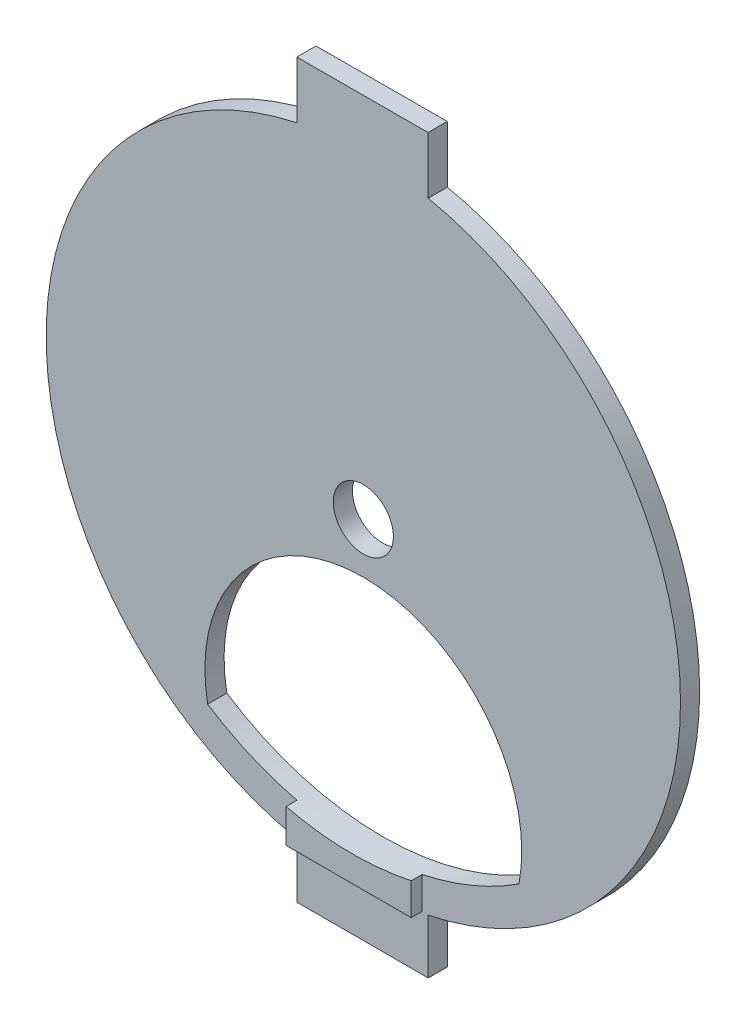
ISO-10303-21;
HEADER;
FILE_DESCRIPTION(('STEP AP214'),'2;1');
FILE_NAME('part.step','',(''),(''),'','','');
FILE_SCHEMA(('AUTOMOTIVE_DESIGN { 1 0 10303 214 1 1 1 1 }'));
ENDSEC;
DATA;
#1=APPLICATION_CONTEXT('core data for automotive mechanical design processes');
#2=APPLICATION_PROTOCOL_DEFINITION('international standard','automotive_design',2000,#1);
#3=PRODUCT_CONTEXT('',#1,'mechanical');
#4=PRODUCT('Part','Part','',(#3));
#5=PRODUCT_RELATED_PRODUCT_CATEGORY('part','',(#4));
#6=PRODUCT_DEFINITION_FORMATION('','',#4);
#7=PRODUCT_DEFINITION_CONTEXT('part definition',#1,'design');
#8=PRODUCT_DEFINITION('design','',#6,#7);
#9=PRODUCT_DEFINITION_SHAPE('','',#8);
#10=(LENGTH_UNIT() NAMED_UNIT(*) SI_UNIT(.MILLI.,.METRE.));
#11=(NAMED_UNIT(*) PLANE_ANGLE_UNIT() SI_UNIT($,.RADIAN.));
#12=(NAMED_UNIT(*) SI_UNIT($,.STERADIAN.) SOLID_ANGLE_UNIT());
#13=UNCERTAINTY_MEASURE_WITH_UNIT(LENGTH_MEASURE(1.E-05),#10,'distance_accuracy_value','');
#14=(GEOMETRIC_REPRESENTATION_CONTEXT(3) GLOBAL_UNCERTAINTY_ASSIGNED_CONTEXT((#13)) GLOBAL_UNIT_ASSIGNED_CONTEXT((#10,
#11,#12)) REPRESENTATION_CONTEXT('',''));
#15=CARTESIAN_POINT('',(0.,0.,0.));
#16=DIRECTION('',(0.,0.,1.));
#17=DIRECTION('',(1.,0.,0.));
#18=AXIS2_PLACEMENT_3D('',#15,#16,#17);
#19=CARTESIAN_POINT('',(0.,0.,11.1252));
#20=DIRECTION('',(0.,0.,1.));
#21=DIRECTION('',(1.,0.,0.));
#22=AXIS2_PLACEMENT_3D('',#19,#20,#21);
#23=PLANE('',#22);
#24=CARTESIAN_POINT('',(0.,0.,11.1252));
#25=DIRECTION('',(0.,0.,1.));
#26=DIRECTION('',(1.,0.,0.));
#27=AXIS2_PLACEMENT_3D('',#24,#25,#26);
#28=CIRCLE('',#27,17.4625);
#29=CARTESIAN_POINT('',(17.4625,0.,11.1252));
#30=VERTEX_POINT('',#29);
#31=EDGE_CURVE('E336',#30,#30,#28,.T.);
#32=ORIENTED_EDGE('',*,*,#31,.F.);
#33=EDGE_LOOP('',(#32));
#34=FACE_BOUND('',#33,.T.);
#35=CARTESIAN_POINT('',(0.,0.,11.1252));
#36=DIRECTION('',(0.,0.,1.));
#37=DIRECTION('',(1.,0.,0.));
#38=AXIS2_PLACEMENT_3D('',#35,#36,#37);
#39=CIRCLE('',#38,184.15);
#40=CARTESIAN_POINT('',(-38.5208823396615,180.07599541242,11.1252));
#41=VERTEX_POINT('',#40);
#42=CARTESIAN_POINT('',(-38.5208823396615,-180.07599541242,11.1252));
#43=VERTEX_POINT('',#42);
#44=EDGE_CURVE('E366',#41,#43,#39,.T.);
#45=ORIENTED_EDGE('',*,*,#44,.T.);
#46=DIRECTION('',(0.,1.,0.));
#47=VECTOR('',#46,1.);
#48=CARTESIAN_POINT('',(-38.5208823396615,0.,11.1252));
#49=LINE('',#48,#47);
#50=CARTESIAN_POINT('',(-38.5208823396615,-160.543301398015,11.1252));
#51=VERTEX_POINT('',#50);
#52=EDGE_CURVE('E215',#43,#51,#49,.T.);
#53=ORIENTED_EDGE('',*,*,#52,.T.);
#54=CARTESIAN_POINT('',(0.,0.,11.1252));
#55=DIRECTION('',(0.,0.,1.));
#56=DIRECTION('',(1.,0.,0.));
#57=AXIS2_PLACEMENT_3D('',#54,#55,#56);
#58=CIRCLE('',#57,165.1);
#59=CARTESIAN_POINT('',(-90.375326038002,-138.167689578732,11.1252));
#60=VERTEX_POINT('',#59);
#61=EDGE_CURVE('E322',#60,#51,#58,.T.);
#62=ORIENTED_EDGE('',*,*,#61,.F.);
#63=CARTESIAN_POINT('',(0.,-121.099295255726,11.1252));
#64=DIRECTION('',(0.,0.,1.));
#65=DIRECTION('',(1.,0.,0.));
#66=AXIS2_PLACEMENT_3D('',#63,#64,#65);
#67=CIRCLE('',#66,91.9729832137721);
#68=CARTESIAN_POINT('',(90.375326038002,-138.167689578732,11.1252));
#69=VERTEX_POINT('',#68);
#70=EDGE_CURVE('E313',#60,#69,#67,.F.);
#71=ORIENTED_EDGE('',*,*,#70,.T.);
#72=CARTESIAN_POINT('',(34.1499767632428,-161.529530077537,11.1252));
#73=VERTEX_POINT('',#72);
#74=EDGE_CURVE('E316',#73,#69,#58,.T.);
#75=ORIENTED_EDGE('',*,*,#74,.F.);
#76=DIRECTION('',(0.,1.,0.));
#77=VECTOR('',#76,1.);
#78=CARTESIAN_POINT('',(34.1499767632428,0.,11.1252));
#79=LINE('',#78,#77);
#80=CARTESIAN_POINT('',(34.1499767632428,-180.07599541242,11.1252));
#81=VERTEX_POINT('',#80);
#82=EDGE_CURVE('E208',#81,#73,#79,.T.);
#83=ORIENTED_EDGE('',*,*,#82,.F.);
#84=DIRECTION('',(1.,0.,0.));
#85=VECTOR('',#84,1.);
#86=CARTESIAN_POINT('',(0.,-180.07599541242,11.1252));
#87=LINE('',#86,#85);
#88=EDGE_CURVE('E312',#43,#81,#87,.T.);
#89=ORIENTED_EDGE('',*,*,#88,.F.);
#90=DIRECTION('',(0.,-1.,0.));
#91=VECTOR('',#90,1.);
#92=CARTESIAN_POINT('',(-38.5208823396615,0.,11.1252));
#93=LINE('',#92,#91);
#94=CARTESIAN_POINT('',(-38.5208823396615,-211.82599541242,11.1252));
#95=VERTEX_POINT('',#94);
#96=EDGE_CURVE('E376',#43,#95,#93,.T.);
#97=ORIENTED_EDGE('',*,*,#96,.T.);
#98=DIRECTION('',(1.,0.,0.));
#99=VECTOR('',#98,1.);
#100=CARTESIAN_POINT('',(0.,-211.82599541242,11.1252));
#101=LINE('',#100,#99);
#102=CARTESIAN_POINT('',(37.6791176603385,-211.82599541242,11.1252));
#103=VERTEX_POINT('',#102);
#104=EDGE_CURVE('E378',#95,#103,#101,.T.);
#105=ORIENTED_EDGE('',*,*,#104,.T.);
#106=DIRECTION('',(0.,-1.,0.));
#107=VECTOR('',#106,1.);
#108=CARTESIAN_POINT('',(37.6791176603384,0.,11.1252));
#109=LINE('',#108,#107);
#110=CARTESIAN_POINT('',(37.6791176603385,-180.254005759479,11.1252));
#111=VERTEX_POINT('',#110);
#112=EDGE_CURVE('E381',#111,#103,#109,.T.);
#113=ORIENTED_EDGE('',*,*,#112,.F.);
#114=CARTESIAN_POINT('',(37.6791176603385,180.254005759479,11.1252));
#115=VERTEX_POINT('',#114);
#116=EDGE_CURVE('E368',#111,#115,#39,.T.);
#117=ORIENTED_EDGE('',*,*,#116,.T.);
#118=DIRECTION('',(-0.00233608741903019,0.999997271344063,0.));
#119=VECTOR('',#118,1.);
#120=CARTESIAN_POINT('',(38.1,0.0890051735295454,11.1252));
#121=LINE('',#120,#119);
#122=CARTESIAN_POINT('',(37.6019798432796,213.274005759479,11.1252));
#123=VERTEX_POINT('',#122);
#124=EDGE_CURVE('E343',#115,#123,#121,.T.);
#125=ORIENTED_EDGE('',*,*,#124,.T.);
#126=DIRECTION('',(0.999997271344063,0.00233608741903044,0.));
#127=VECTOR('',#126,1.);
#128=CARTESIAN_POINT('',(-0.498020156720491,213.18500058595,11.1252));
#129=LINE('',#128,#127);
#130=CARTESIAN_POINT('',(-38.5980201567204,213.09599541242,11.1252));
#131=VERTEX_POINT('',#130);
#132=EDGE_CURVE('E345',#131,#123,#129,.T.);
#133=ORIENTED_EDGE('',*,*,#132,.F.);
#134=DIRECTION('',(-0.00233608741903019,0.999997271344063,0.));
#135=VECTOR('',#134,1.);
#136=CARTESIAN_POINT('',(-38.1,-0.0890051735295453,11.1252));
#137=LINE('',#136,#135);
#138=EDGE_CURVE('E349',#41,#131,#137,.T.);
#139=ORIENTED_EDGE('',*,*,#138,.F.);
#140=EDGE_LOOP('',(#45,#53,#62,#71,#75,#83,#89,#97,#105,#113,#117,#125,#133,#139));
#141=FACE_BOUND('',#140,.T.);
#142=ADVANCED_FACE('F191',(#34,#141),#23,.T.);
#143=CARTESIAN_POINT('',(0.,0.,0.));
#144=DIRECTION('',(0.,0.,1.));
#145=DIRECTION('',(1.,0.,0.));
#146=AXIS2_PLACEMENT_3D('',#143,#144,#145);
#147=PLANE('',#146);
#148=DIRECTION('',(-0.00233608741903019,0.999997271344063,0.));
#149=VECTOR('',#148,1.);
#150=CARTESIAN_POINT('',(38.1,0.0890051735295454,0.));
#151=LINE('',#150,#149);
#152=CARTESIAN_POINT('',(37.6791176603385,180.254005759479,0.));
#153=VERTEX_POINT('',#152);
#154=CARTESIAN_POINT('',(37.6019798432796,213.274005759479,0.));
#155=VERTEX_POINT('',#154);
#156=EDGE_CURVE('E353',#153,#155,#151,.T.);
#157=ORIENTED_EDGE('',*,*,#156,.F.);
#158=CARTESIAN_POINT('',(0.,0.,0.));
#159=DIRECTION('',(0.,0.,1.));
#160=DIRECTION('',(1.,0.,0.));
#161=AXIS2_PLACEMENT_3D('',#158,#159,#160);
#162=CIRCLE('',#161,184.15);
#163=CARTESIAN_POINT('',(37.6791176603385,-180.254005759479,0.));
#164=VERTEX_POINT('',#163);
#165=EDGE_CURVE('E369',#164,#153,#162,.T.);
#166=ORIENTED_EDGE('',*,*,#165,.F.);
#167=DIRECTION('',(0.,-1.,0.));
#168=VECTOR('',#167,1.);
#169=CARTESIAN_POINT('',(37.6791176603384,0.,0.));
#170=LINE('',#169,#168);
#171=CARTESIAN_POINT('',(37.6791176603385,-211.82599541242,0.));
#172=VERTEX_POINT('',#171);
#173=EDGE_CURVE('E379',#164,#172,#170,.T.);
#174=ORIENTED_EDGE('',*,*,#173,.T.);
#175=DIRECTION('',(1.,0.,0.));
#176=VECTOR('',#175,1.);
#177=CARTESIAN_POINT('',(0.,-211.82599541242,0.));
#178=LINE('',#177,#176);
#179=CARTESIAN_POINT('',(-38.5208823396615,-211.82599541242,0.));
#180=VERTEX_POINT('',#179);
#181=EDGE_CURVE('E386',#180,#172,#178,.T.);
#182=ORIENTED_EDGE('',*,*,#181,.F.);
#183=DIRECTION('',(0.,-1.,0.));
#184=VECTOR('',#183,1.);
#185=CARTESIAN_POINT('',(-38.5208823396615,0.,0.));
#186=LINE('',#185,#184);
#187=CARTESIAN_POINT('',(-38.5208823396615,-180.07599541242,0.));
#188=VERTEX_POINT('',#187);
#189=EDGE_CURVE('E342',#188,#180,#186,.T.);
#190=ORIENTED_EDGE('',*,*,#189,.F.);
#191=CARTESIAN_POINT('',(-38.5208823396615,180.07599541242,0.));
#192=VERTEX_POINT('',#191);
#193=EDGE_CURVE('E370',#192,#188,#162,.T.);
#194=ORIENTED_EDGE('',*,*,#193,.F.);
#195=DIRECTION('',(-0.00233608741903019,0.999997271344063,0.));
#196=VECTOR('',#195,1.);
#197=CARTESIAN_POINT('',(-38.1,-0.0890051735295453,0.));
#198=LINE('',#197,#196);
#199=CARTESIAN_POINT('',(-38.5980201567204,213.09599541242,0.));
#200=VERTEX_POINT('',#199);
#201=EDGE_CURVE('E346',#192,#200,#198,.T.);
#202=ORIENTED_EDGE('',*,*,#201,.T.);
#203=DIRECTION('',(0.999997271344063,0.00233608741903044,0.));
#204=VECTOR('',#203,1.);
#205=CARTESIAN_POINT('',(-0.498020156720491,213.18500058595,0.));
#206=LINE('',#205,#204);
#207=EDGE_CURVE('E356',#200,#155,#206,.T.);
#208=ORIENTED_EDGE('',*,*,#207,.T.);
#209=EDGE_LOOP('',(#157,#166,#174,#182,#190,#194,#202,#208));
#210=FACE_BOUND('',#209,.T.);
#211=CARTESIAN_POINT('',(0.,0.,0.));
#212=DIRECTION('',(0.,0.,1.));
#213=DIRECTION('',(1.,0.,0.));
#214=AXIS2_PLACEMENT_3D('',#211,#212,#213);
#215=CIRCLE('',#214,17.4625);
#216=CARTESIAN_POINT('',(17.4625,0.,0.));
#217=VERTEX_POINT('',#216);
#218=EDGE_CURVE('E339',#217,#217,#215,.T.);
#219=ORIENTED_EDGE('',*,*,#218,.T.);
#220=EDGE_LOOP('',(#219));
#221=FACE_BOUND('',#220,.T.);
#222=CARTESIAN_POINT('',(0.,-121.099295255726,0.));
#223=DIRECTION('',(0.,0.,1.));
#224=DIRECTION('',(1.,0.,0.));
#225=AXIS2_PLACEMENT_3D('',#222,#223,#224);
#226=CIRCLE('',#225,91.9729832137721);
#227=CARTESIAN_POINT('',(-90.375326038002,-138.167689578732,0.));
#228=VERTEX_POINT('',#227);
#229=CARTESIAN_POINT('',(90.375326038002,-138.167689578732,0.));
#230=VERTEX_POINT('',#229);
#231=EDGE_CURVE('E333',#228,#230,#226,.F.);
#232=ORIENTED_EDGE('',*,*,#231,.F.);
#233=CARTESIAN_POINT('',(0.,0.,0.));
#234=DIRECTION('',(0.,0.,1.));
#235=DIRECTION('',(1.,0.,0.));
#236=AXIS2_PLACEMENT_3D('',#233,#234,#235);
#237=CIRCLE('',#236,165.1);
#238=EDGE_CURVE('E328',#228,#230,#237,.T.);
#239=ORIENTED_EDGE('',*,*,#238,.T.);
#240=EDGE_LOOP('',(#232,#239));
#241=FACE_BOUND('',#240,.T.);
#242=ADVANCED_FACE('F404',(#210,#221,#241),#147,.F.);
#243=CARTESIAN_POINT('',(38.1,0.0890051735295454,11.1252));
#244=DIRECTION('',(-0.999997271344062,-0.00233608741903019,0.));
#245=DIRECTION('',(0.00233608741903019,-0.999997271344063,0.));
#246=AXIS2_PLACEMENT_3D('',#243,#244,#245);
#247=PLANE('',#246);
#248=ORIENTED_EDGE('',*,*,#156,.T.);
#249=DIRECTION('',(0.,0.,-1.));
#250=VECTOR('',#249,1.);
#251=CARTESIAN_POINT('',(37.6019798432796,213.274005759479,11.1252));
#252=LINE('',#251,#250);
#253=EDGE_CURVE('E200',#123,#155,#252,.T.);
#254=ORIENTED_EDGE('',*,*,#253,.F.);
#255=ORIENTED_EDGE('',*,*,#124,.F.);
#256=DIRECTION('',(0.,0.,-1.));
#257=VECTOR('',#256,1.);
#258=CARTESIAN_POINT('',(37.6791176603385,180.254005759479,11.1252));
#259=LINE('',#258,#257);
#260=EDGE_CURVE('E12',#115,#153,#259,.T.);
#261=ORIENTED_EDGE('',*,*,#260,.T.);
#262=EDGE_LOOP('',(#248,#254,#255,#261));
#263=FACE_BOUND('',#262,.T.);
#264=ADVANCED_FACE('F417',(#263),#247,.F.);
#265=CARTESIAN_POINT('',(-0.498020156720491,213.18500058595,11.1252));
#266=DIRECTION('',(-0.00233608741903044,0.999997271344062,0.));
#267=DIRECTION('',(-0.999997271344063,-0.00233608741903044,0.));
#268=AXIS2_PLACEMENT_3D('',#265,#266,#267);
#269=PLANE('',#268);
#270=ORIENTED_EDGE('',*,*,#207,.F.);
#271=DIRECTION('',(0.,0.,-1.));
#272=VECTOR('',#271,1.);
#273=CARTESIAN_POINT('',(-38.5980201567204,213.09599541242,11.1252));
#274=LINE('',#273,#272);
#275=EDGE_CURVE('E363',#131,#200,#274,.T.);
#276=ORIENTED_EDGE('',*,*,#275,.F.);
#277=ORIENTED_EDGE('',*,*,#132,.T.);
#278=ORIENTED_EDGE('',*,*,#253,.T.);
#279=EDGE_LOOP('',(#270,#276,#277,#278));
#280=FACE_BOUND('',#279,.T.);
#281=ADVANCED_FACE('F454',(#280),#269,.T.);
#282=CARTESIAN_POINT('',(-38.1,-0.0890051735295453,11.1252));
#283=DIRECTION('',(-0.999997271344062,-0.00233608741903019,0.));
#284=DIRECTION('',(0.00233608741903019,-0.999997271344063,0.));
#285=AXIS2_PLACEMENT_3D('',#282,#283,#284);
#286=PLANE('',#285);
#287=ORIENTED_EDGE('',*,*,#201,.F.);
#288=DIRECTION('',(0.,0.,-1.));
#289=VECTOR('',#288,1.);
#290=CARTESIAN_POINT('',(-38.5208823396615,180.07599541242,11.1252));
#291=LINE('',#290,#289);
#292=EDGE_CURVE('E352',#41,#192,#291,.T.);
#293=ORIENTED_EDGE('',*,*,#292,.F.);
#294=ORIENTED_EDGE('',*,*,#138,.T.);
#295=ORIENTED_EDGE('',*,*,#275,.T.);
#296=EDGE_LOOP('',(#287,#293,#294,#295));
#297=FACE_BOUND('',#296,.T.);
#298=ADVANCED_FACE('F424',(#297),#286,.T.);
#299=CARTESIAN_POINT('',(0.,-211.82599541242,11.1252));
#300=DIRECTION('',(0.,1.,0.));
#301=DIRECTION('',(-1.,0.,0.));
#302=AXIS2_PLACEMENT_3D('',#299,#300,#301);
#303=PLANE('',#302);
#304=ORIENTED_EDGE('',*,*,#181,.T.);
#305=DIRECTION('',(0.,0.,-1.));
#306=VECTOR('',#305,1.);
#307=CARTESIAN_POINT('',(37.6791176603385,-211.82599541242,11.1252));
#308=LINE('',#307,#306);
#309=EDGE_CURVE('E384',#103,#172,#308,.T.);
#310=ORIENTED_EDGE('',*,*,#309,.F.);
#311=ORIENTED_EDGE('',*,*,#104,.F.);
#312=DIRECTION('',(0.,0.,-1.));
#313=VECTOR('',#312,1.);
#314=CARTESIAN_POINT('',(-38.5208823396615,-211.82599541242,11.1252));
#315=LINE('',#314,#313);
#316=EDGE_CURVE('E195',#95,#180,#315,.T.);
#317=ORIENTED_EDGE('',*,*,#316,.T.);
#318=EDGE_LOOP('',(#304,#310,#311,#317));
#319=FACE_BOUND('',#318,.T.);
#320=ADVANCED_FACE('F398',(#319),#303,.F.);
#321=CARTESIAN_POINT('',(37.6791176603384,0.,11.1252));
#322=DIRECTION('',(1.,0.,0.));
#323=DIRECTION('',(0.,1.,0.));
#324=AXIS2_PLACEMENT_3D('',#321,#322,#323);
#325=PLANE('',#324);
#326=ORIENTED_EDGE('',*,*,#173,.F.);
#327=DIRECTION('',(0.,0.,-1.));
#328=VECTOR('',#327,1.);
#329=CARTESIAN_POINT('',(37.6791176603385,-180.254005759479,11.1252));
#330=LINE('',#329,#328);
#331=EDGE_CURVE('E373',#111,#164,#330,.T.);
#332=ORIENTED_EDGE('',*,*,#331,.F.);
#333=ORIENTED_EDGE('',*,*,#112,.T.);
#334=ORIENTED_EDGE('',*,*,#309,.T.);
#335=EDGE_LOOP('',(#326,#332,#333,#334));
#336=FACE_BOUND('',#335,.T.);
#337=ADVANCED_FACE('F409',(#336),#325,.T.);
#338=CARTESIAN_POINT('',(-38.5208823396615,0.,11.1252));
#339=DIRECTION('',(1.,0.,0.));
#340=DIRECTION('',(0.,1.,0.));
#341=AXIS2_PLACEMENT_3D('',#338,#339,#340);
#342=PLANE('',#341);
#343=ORIENTED_EDGE('',*,*,#189,.T.);
#344=ORIENTED_EDGE('',*,*,#316,.F.);
#345=ORIENTED_EDGE('',*,*,#96,.F.);
#346=DIRECTION('',(0.,0.,-1.));
#347=VECTOR('',#346,1.);
#348=CARTESIAN_POINT('',(-38.5208823396615,-180.07599541242,11.1252));
#349=LINE('',#348,#347);
#350=EDGE_CURVE('E357',#43,#188,#349,.T.);
#351=ORIENTED_EDGE('',*,*,#350,.T.);
#352=EDGE_LOOP('',(#343,#344,#345,#351));
#353=FACE_BOUND('',#352,.T.);
#354=ADVANCED_FACE('F193',(#353),#342,.F.);
#355=CARTESIAN_POINT('',(0.,0.,11.1252));
#356=DIRECTION('',(0.,0.,-1.));
#357=DIRECTION('',(-1.,0.,0.));
#358=AXIS2_PLACEMENT_3D('',#355,#356,#357);
#359=CYLINDRICAL_SURFACE('',#358,184.15);
#360=ORIENTED_EDGE('',*,*,#193,.T.);
#361=ORIENTED_EDGE('',*,*,#350,.F.);
#362=ORIENTED_EDGE('',*,*,#44,.F.);
#363=ORIENTED_EDGE('',*,*,#292,.T.);
#364=EDGE_LOOP('',(#360,#361,#362,#363));
#365=FACE_BOUND('',#364,.T.);
#366=ADVANCED_FACE('F429',(#365),#359,.T.);
#367=ORIENTED_EDGE('',*,*,#165,.T.);
#368=ORIENTED_EDGE('',*,*,#260,.F.);
#369=ORIENTED_EDGE('',*,*,#116,.F.);
#370=ORIENTED_EDGE('',*,*,#331,.T.);
#371=EDGE_LOOP('',(#367,#368,#369,#370));
#372=FACE_BOUND('',#371,.T.);
#373=ADVANCED_FACE('F415',(#372),#359,.T.);
#374=CARTESIAN_POINT('',(0.,0.,-1.5748));
#375=DIRECTION('',(0.,0.,1.));
#376=DIRECTION('',(1.,0.,0.));
#377=AXIS2_PLACEMENT_3D('',#374,#375,#376);
#378=CYLINDRICAL_SURFACE('',#377,17.4625);
#379=ORIENTED_EDGE('',*,*,#31,.T.);
#380=EDGE_LOOP('',(#379));
#381=FACE_BOUND('',#380,.T.);
#382=ORIENTED_EDGE('',*,*,#218,.F.);
#383=EDGE_LOOP('',(#382));
#384=FACE_BOUND('',#383,.T.);
#385=ADVANCED_FACE('F466',(#381,#384),#378,.F.);
#386=CARTESIAN_POINT('',(0.,-121.099295255726,-1.5748));
#387=DIRECTION('',(0.,0.,1.));
#388=DIRECTION('',(1.,0.,0.));
#389=AXIS2_PLACEMENT_3D('',#386,#387,#388);
#390=CYLINDRICAL_SURFACE('',#389,91.9729832137721);
#391=ORIENTED_EDGE('',*,*,#231,.T.);
#392=DIRECTION('',(0.,0.,1.));
#393=VECTOR('',#392,1.);
#394=CARTESIAN_POINT('',(90.375326038002,-138.167689578732,-1.5748));
#395=LINE('',#394,#393);
#396=EDGE_CURVE('E325',#230,#69,#395,.T.);
#397=ORIENTED_EDGE('',*,*,#396,.T.);
#398=ORIENTED_EDGE('',*,*,#70,.F.);
#399=DIRECTION('',(0.,0.,1.));
#400=VECTOR('',#399,1.);
#401=CARTESIAN_POINT('',(-90.375326038002,-138.167689578732,-1.5748));
#402=LINE('',#401,#400);
#403=EDGE_CURVE('E324',#228,#60,#402,.T.);
#404=ORIENTED_EDGE('',*,*,#403,.F.);
#405=EDGE_LOOP('',(#391,#397,#398,#404));
#406=FACE_BOUND('',#405,.T.);
#407=ADVANCED_FACE('F445',(#406),#390,.F.);
#408=CARTESIAN_POINT('',(0.,0.,-1.5748));
#409=DIRECTION('',(0.,0.,1.));
#410=DIRECTION('',(1.,0.,0.));
#411=AXIS2_PLACEMENT_3D('',#408,#409,#410);
#412=CYLINDRICAL_SURFACE('',#411,165.1);
#413=ORIENTED_EDGE('',*,*,#403,.T.);
#414=ORIENTED_EDGE('',*,*,#61,.T.);
#415=DIRECTION('',(0.,0.,-1.));
#416=VECTOR('',#415,1.);
#417=CARTESIAN_POINT('',(-38.5208823396615,-160.543301398015,17.4752));
#418=LINE('',#417,#416);
#419=CARTESIAN_POINT('',(-38.5208823396615,-160.543301398015,17.4752));
#420=VERTEX_POINT('',#419);
#421=EDGE_CURVE('E318',#420,#51,#418,.T.);
#422=ORIENTED_EDGE('',*,*,#421,.F.);
#423=CARTESIAN_POINT('',(0.,0.,17.4752));
#424=DIRECTION('',(0.,0.,1.));
#425=DIRECTION('',(1.,0.,0.));
#426=AXIS2_PLACEMENT_3D('',#423,#424,#425);
#427=CIRCLE('',#426,165.1);
#428=CARTESIAN_POINT('',(34.1499767632428,-161.529530077537,17.4752));
#429=VERTEX_POINT('',#428);
#430=EDGE_CURVE('E300',#429,#420,#427,.F.);
#431=ORIENTED_EDGE('',*,*,#430,.F.);
#432=DIRECTION('',(0.,0.,-1.));
#433=VECTOR('',#432,1.);
#434=CARTESIAN_POINT('',(34.1499767632428,-161.529530077537,17.4752));
#435=LINE('',#434,#433);
#436=EDGE_CURVE('E297',#429,#73,#435,.T.);
#437=ORIENTED_EDGE('',*,*,#436,.T.);
#438=ORIENTED_EDGE('',*,*,#74,.T.);
#439=ORIENTED_EDGE('',*,*,#396,.F.);
#440=ORIENTED_EDGE('',*,*,#238,.F.);
#441=EDGE_LOOP('',(#413,#414,#422,#431,#437,#438,#439,#440));
#442=FACE_BOUND('',#441,.T.);
#443=ADVANCED_FACE('F442',(#442),#412,.F.);
#444=CARTESIAN_POINT('',(0.,-180.07599541242,17.4752));
#445=DIRECTION('',(0.,1.,0.));
#446=DIRECTION('',(0.,0.,1.));
#447=AXIS2_PLACEMENT_3D('',#444,#445,#446);
#448=PLANE('',#447);
#449=ORIENTED_EDGE('',*,*,#88,.T.);
#450=DIRECTION('',(0.,0.,-1.));
#451=VECTOR('',#450,1.);
#452=CARTESIAN_POINT('',(34.1499767632428,-180.07599541242,17.4752));
#453=LINE('',#452,#451);
#454=CARTESIAN_POINT('',(34.1499767632428,-180.07599541242,17.4752));
#455=VERTEX_POINT('',#454);
#456=EDGE_CURVE('E294',#455,#81,#453,.T.);
#457=ORIENTED_EDGE('',*,*,#456,.F.);
#458=DIRECTION('',(1.,0.,0.));
#459=VECTOR('',#458,1.);
#460=CARTESIAN_POINT('',(0.,-180.07599541242,17.4752));
#461=LINE('',#460,#459);
#462=CARTESIAN_POINT('',(-38.5208823396615,-180.07599541242,17.4752));
#463=VERTEX_POINT('',#462);
#464=EDGE_CURVE('E301',#463,#455,#461,.T.);
#465=ORIENTED_EDGE('',*,*,#464,.F.);
#466=DIRECTION('',(0.,0.,-1.));
#467=VECTOR('',#466,1.);
#468=CARTESIAN_POINT('',(-38.5208823396615,-180.07599541242,17.4752));
#469=LINE('',#468,#467);
#470=EDGE_CURVE('E430',#463,#43,#469,.T.);
#471=ORIENTED_EDGE('',*,*,#470,.T.);
#472=EDGE_LOOP('',(#449,#457,#465,#471));
#473=FACE_BOUND('',#472,.T.);
#474=ADVANCED_FACE('F311',(#473),#448,.F.);
#475=CARTESIAN_POINT('',(34.1499767632428,0.,17.4752));
#476=DIRECTION('',(-1.,0.,0.));
#477=DIRECTION('',(0.,0.,1.));
#478=AXIS2_PLACEMENT_3D('',#475,#476,#477);
#479=PLANE('',#478);
#480=ORIENTED_EDGE('',*,*,#82,.T.);
#481=ORIENTED_EDGE('',*,*,#436,.F.);
#482=DIRECTION('',(0.,1.,0.));
#483=VECTOR('',#482,1.);
#484=CARTESIAN_POINT('',(34.1499767632428,0.,17.4752));
#485=LINE('',#484,#483);
#486=EDGE_CURVE('E290',#455,#429,#485,.T.);
#487=ORIENTED_EDGE('',*,*,#486,.F.);
#488=ORIENTED_EDGE('',*,*,#456,.T.);
#489=EDGE_LOOP('',(#480,#481,#487,#488));
#490=FACE_BOUND('',#489,.T.);
#491=ADVANCED_FACE('F292',(#490),#479,.F.);
#492=CARTESIAN_POINT('',(-38.5208823396615,0.,17.4752));
#493=DIRECTION('',(-1.,0.,0.));
#494=DIRECTION('',(0.,-1.,0.));
#495=AXIS2_PLACEMENT_3D('',#492,#493,#494);
#496=PLANE('',#495);
#497=ORIENTED_EDGE('',*,*,#52,.F.);
#498=ORIENTED_EDGE('',*,*,#470,.F.);
#499=DIRECTION('',(0.,1.,0.));
#500=VECTOR('',#499,1.);
#501=CARTESIAN_POINT('',(-38.5208823396615,0.,17.4752));
#502=LINE('',#501,#500);
#503=EDGE_CURVE('E307',#463,#420,#502,.T.);
#504=ORIENTED_EDGE('',*,*,#503,.T.);
#505=ORIENTED_EDGE('',*,*,#421,.T.);
#506=EDGE_LOOP('',(#497,#498,#504,#505));
#507=FACE_BOUND('',#506,.T.);
#508=ADVANCED_FACE('F434',(#507),#496,.T.);
#509=CARTESIAN_POINT('',(0.,0.,17.4752));
#510=DIRECTION('',(0.,0.,1.));
#511=DIRECTION('',(1.,0.,0.));
#512=AXIS2_PLACEMENT_3D('',#509,#510,#511);
#513=PLANE('',#512);
#514=ORIENTED_EDGE('',*,*,#464,.T.);
#515=ORIENTED_EDGE('',*,*,#486,.T.);
#516=ORIENTED_EDGE('',*,*,#430,.T.);
#517=ORIENTED_EDGE('',*,*,#503,.F.);
#518=EDGE_LOOP('',(#514,#515,#516,#517));
#519=FACE_BOUND('',#518,.T.);
#520=ADVANCED_FACE('F305',(#519),#513,.T.);
#521=CLOSED_SHELL('',(#142,#242,#264,#281,#298,#320,#337,#354,#366,#373,#385,#407,#443,#474,
#491,#508,#520));
#522=MANIFOLD_SOLID_BREP('B2',#521);
#523=ADVANCED_BREP_SHAPE_REPRESENTATION('',(#18,#522),#14);
#524=SHAPE_DEFINITION_REPRESENTATION(#9,#523);
ENDSEC;
END-ISO-10303-21;
